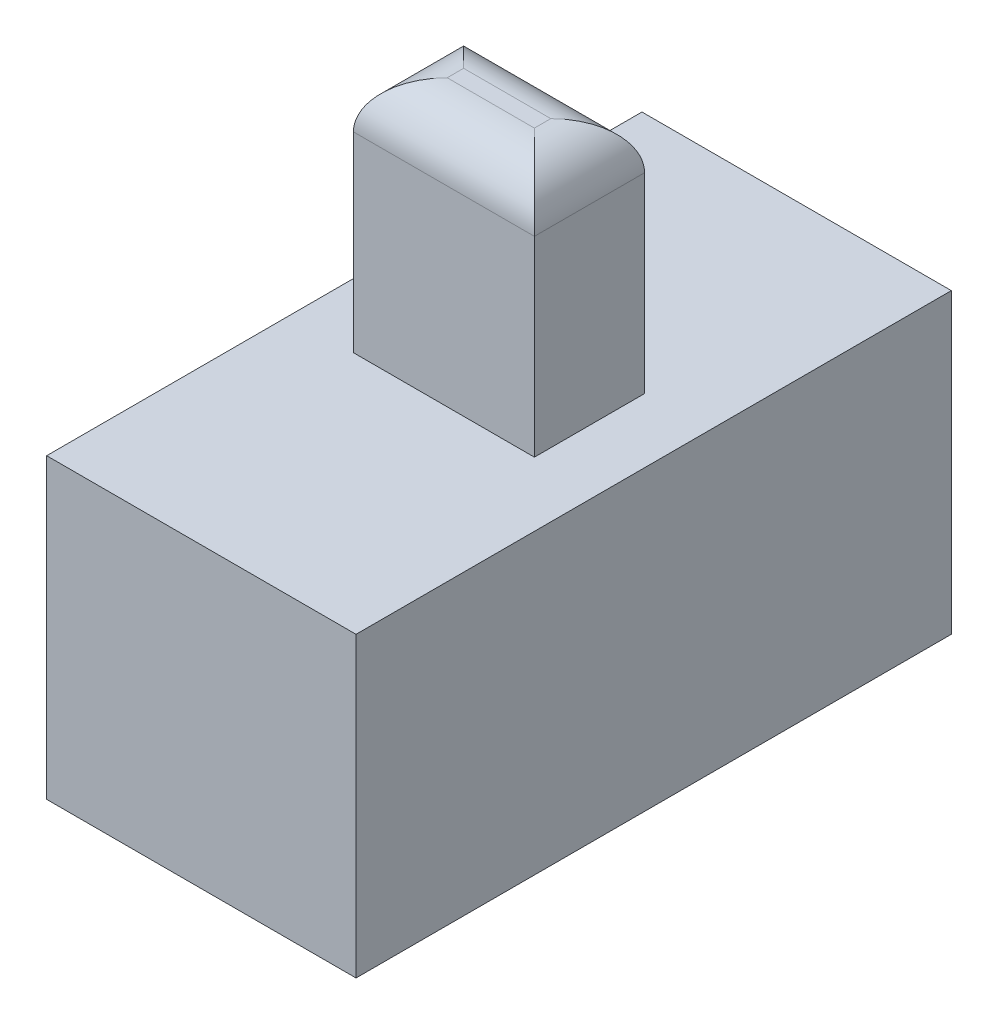
ISO-10303-21;
HEADER;
FILE_DESCRIPTION(('STEP AP214'),'2;1');
FILE_NAME('part.step','',(''),(''),'','','');
FILE_SCHEMA(('AUTOMOTIVE_DESIGN { 1 0 10303 214 1 1 1 1 }'));
ENDSEC;
DATA;
#1=APPLICATION_CONTEXT('core data for automotive mechanical design processes');
#2=APPLICATION_PROTOCOL_DEFINITION('international standard','automotive_design',2000,#1);
#3=PRODUCT_CONTEXT('',#1,'mechanical');
#4=PRODUCT('Part','Part','',(#3));
#5=PRODUCT_RELATED_PRODUCT_CATEGORY('part','',(#4));
#6=PRODUCT_DEFINITION_FORMATION('','',#4);
#7=PRODUCT_DEFINITION_CONTEXT('part definition',#1,'design');
#8=PRODUCT_DEFINITION('design','',#6,#7);
#9=PRODUCT_DEFINITION_SHAPE('','',#8);
#10=(LENGTH_UNIT() NAMED_UNIT(*) SI_UNIT(.MILLI.,.METRE.));
#11=(NAMED_UNIT(*) PLANE_ANGLE_UNIT() SI_UNIT($,.RADIAN.));
#12=(NAMED_UNIT(*) SI_UNIT($,.STERADIAN.) SOLID_ANGLE_UNIT());
#13=UNCERTAINTY_MEASURE_WITH_UNIT(LENGTH_MEASURE(1.E-05),#10,'distance_accuracy_value','');
#14=(GEOMETRIC_REPRESENTATION_CONTEXT(3) GLOBAL_UNCERTAINTY_ASSIGNED_CONTEXT((#13)) GLOBAL_UNIT_ASSIGNED_CONTEXT((#10,
#11,#12)) REPRESENTATION_CONTEXT('',''));
#15=CARTESIAN_POINT('',(0.,0.,0.));
#16=DIRECTION('',(0.,0.,1.));
#17=DIRECTION('',(1.,0.,0.));
#18=AXIS2_PLACEMENT_3D('',#15,#16,#17);
#19=CARTESIAN_POINT('',(0.,6.35,0.));
#20=DIRECTION('',(0.,-1.,0.));
#21=DIRECTION('',(0.,0.,-1.));
#22=AXIS2_PLACEMENT_3D('',#19,#20,#21);
#23=PLANE('',#22);
#24=DIRECTION('',(0.,0.,-1.));
#25=VECTOR('',#24,1.);
#26=CARTESIAN_POINT('',(3.3,6.35,6.35));
#27=LINE('',#26,#25);
#28=CARTESIAN_POINT('',(3.3,6.35,6.35));
#29=VERTEX_POINT('',#28);
#30=CARTESIAN_POINT('',(3.3,6.35,-6.35));
#31=VERTEX_POINT('',#30);
#32=EDGE_CURVE('E145',#29,#31,#27,.T.);
#33=ORIENTED_EDGE('',*,*,#32,.T.);
#34=DIRECTION('',(-1.,0.,0.));
#35=VECTOR('',#34,1.);
#36=CARTESIAN_POINT('',(-3.3,6.35,-6.35));
#37=LINE('',#36,#35);
#38=CARTESIAN_POINT('',(-3.3,6.35,-6.35));
#39=VERTEX_POINT('',#38);
#40=EDGE_CURVE('E148',#31,#39,#37,.T.);
#41=ORIENTED_EDGE('',*,*,#40,.T.);
#42=DIRECTION('',(0.,0.,1.));
#43=VECTOR('',#42,1.);
#44=CARTESIAN_POINT('',(-3.3,6.35,6.35));
#45=LINE('',#44,#43);
#46=CARTESIAN_POINT('',(-3.3,6.35,6.35));
#47=VERTEX_POINT('',#46);
#48=EDGE_CURVE('E151',#39,#47,#45,.T.);
#49=ORIENTED_EDGE('',*,*,#48,.T.);
#50=DIRECTION('',(1.,0.,0.));
#51=VECTOR('',#50,1.);
#52=CARTESIAN_POINT('',(-3.3,6.35,6.35));
#53=LINE('',#52,#51);
#54=EDGE_CURVE('E153',#47,#29,#53,.T.);
#55=ORIENTED_EDGE('',*,*,#54,.T.);
#56=EDGE_LOOP('',(#33,#41,#49,#55));
#57=FACE_BOUND('',#56,.T.);
#58=DIRECTION('',(0.,0.,-1.));
#59=VECTOR('',#58,1.);
#60=CARTESIAN_POINT('',(1.93,6.35,1.175));
#61=LINE('',#60,#59);
#62=CARTESIAN_POINT('',(1.93,6.35,1.175));
#63=VERTEX_POINT('',#62);
#64=CARTESIAN_POINT('',(1.93,6.35,-1.175));
#65=VERTEX_POINT('',#64);
#66=EDGE_CURVE('E135',#63,#65,#61,.T.);
#67=ORIENTED_EDGE('',*,*,#66,.F.);
#68=DIRECTION('',(1.,0.,0.));
#69=VECTOR('',#68,1.);
#70=CARTESIAN_POINT('',(-1.93,6.35,1.175));
#71=LINE('',#70,#69);
#72=CARTESIAN_POINT('',(-1.93,6.35,1.175));
#73=VERTEX_POINT('',#72);
#74=EDGE_CURVE('E132',#73,#63,#71,.T.);
#75=ORIENTED_EDGE('',*,*,#74,.F.);
#76=DIRECTION('',(0.,0.,1.));
#77=VECTOR('',#76,1.);
#78=CARTESIAN_POINT('',(-1.93,6.35,1.175));
#79=LINE('',#78,#77);
#80=CARTESIAN_POINT('',(-1.93,6.35,-1.175));
#81=VERTEX_POINT('',#80);
#82=EDGE_CURVE('E118',#81,#73,#79,.T.);
#83=ORIENTED_EDGE('',*,*,#82,.F.);
#84=DIRECTION('',(-1.,0.,0.));
#85=VECTOR('',#84,1.);
#86=CARTESIAN_POINT('',(-1.93,6.35,-1.175));
#87=LINE('',#86,#85);
#88=EDGE_CURVE('E129',#65,#81,#87,.T.);
#89=ORIENTED_EDGE('',*,*,#88,.F.);
#90=EDGE_LOOP('',(#67,#75,#83,#89));
#91=FACE_BOUND('',#90,.T.);
#92=ADVANCED_FACE('F36',(#57,#91),#23,.F.);
#93=CARTESIAN_POINT('',(3.3,6.35,6.35));
#94=DIRECTION('',(-1.,0.,0.));
#95=DIRECTION('',(0.,0.,1.));
#96=AXIS2_PLACEMENT_3D('',#93,#94,#95);
#97=PLANE('',#96);
#98=DIRECTION('',(0.,0.,-1.));
#99=VECTOR('',#98,1.);
#100=CARTESIAN_POINT('',(3.3,0.,6.35));
#101=LINE('',#100,#99);
#102=CARTESIAN_POINT('',(3.3,0.,6.35));
#103=VERTEX_POINT('',#102);
#104=CARTESIAN_POINT('',(3.3,0.,-6.35));
#105=VERTEX_POINT('',#104);
#106=EDGE_CURVE('E144',#103,#105,#101,.T.);
#107=ORIENTED_EDGE('',*,*,#106,.T.);
#108=DIRECTION('',(0.,-1.,0.));
#109=VECTOR('',#108,1.);
#110=CARTESIAN_POINT('',(3.3,6.35,-6.35));
#111=LINE('',#110,#109);
#112=EDGE_CURVE('E171',#31,#105,#111,.T.);
#113=ORIENTED_EDGE('',*,*,#112,.F.);
#114=ORIENTED_EDGE('',*,*,#32,.F.);
#115=DIRECTION('',(0.,-1.,0.));
#116=VECTOR('',#115,1.);
#117=CARTESIAN_POINT('',(3.3,6.35,6.35));
#118=LINE('',#117,#116);
#119=EDGE_CURVE('E155',#29,#103,#118,.T.);
#120=ORIENTED_EDGE('',*,*,#119,.T.);
#121=EDGE_LOOP('',(#107,#113,#114,#120));
#122=FACE_BOUND('',#121,.T.);
#123=ADVANCED_FACE('F220',(#122),#97,.F.);
#124=CARTESIAN_POINT('',(-3.3,6.35,-6.35));
#125=DIRECTION('',(0.,0.,1.));
#126=DIRECTION('',(1.,0.,0.));
#127=AXIS2_PLACEMENT_3D('',#124,#125,#126);
#128=PLANE('',#127);
#129=DIRECTION('',(-1.,0.,0.));
#130=VECTOR('',#129,1.);
#131=CARTESIAN_POINT('',(-3.3,0.,-6.35));
#132=LINE('',#131,#130);
#133=CARTESIAN_POINT('',(-3.3,0.,-6.35));
#134=VERTEX_POINT('',#133);
#135=EDGE_CURVE('E158',#105,#134,#132,.T.);
#136=ORIENTED_EDGE('',*,*,#135,.T.);
#137=DIRECTION('',(0.,-1.,0.));
#138=VECTOR('',#137,1.);
#139=CARTESIAN_POINT('',(-3.3,6.35,-6.35));
#140=LINE('',#139,#138);
#141=EDGE_CURVE('E168',#39,#134,#140,.T.);
#142=ORIENTED_EDGE('',*,*,#141,.F.);
#143=ORIENTED_EDGE('',*,*,#40,.F.);
#144=ORIENTED_EDGE('',*,*,#112,.T.);
#145=EDGE_LOOP('',(#136,#142,#143,#144));
#146=FACE_BOUND('',#145,.T.);
#147=ADVANCED_FACE('F226',(#146),#128,.F.);
#148=CARTESIAN_POINT('',(-3.3,6.35,6.35));
#149=DIRECTION('',(1.,0.,0.));
#150=DIRECTION('',(0.,0.,-1.));
#151=AXIS2_PLACEMENT_3D('',#148,#149,#150);
#152=PLANE('',#151);
#153=DIRECTION('',(0.,0.,1.));
#154=VECTOR('',#153,1.);
#155=CARTESIAN_POINT('',(-3.3,0.,6.35));
#156=LINE('',#155,#154);
#157=CARTESIAN_POINT('',(-3.3,0.,6.35));
#158=VERTEX_POINT('',#157);
#159=EDGE_CURVE('E160',#134,#158,#156,.T.);
#160=ORIENTED_EDGE('',*,*,#159,.T.);
#161=DIRECTION('',(0.,-1.,0.));
#162=VECTOR('',#161,1.);
#163=CARTESIAN_POINT('',(-3.3,6.35,6.35));
#164=LINE('',#163,#162);
#165=EDGE_CURVE('E165',#47,#158,#164,.T.);
#166=ORIENTED_EDGE('',*,*,#165,.F.);
#167=ORIENTED_EDGE('',*,*,#48,.F.);
#168=ORIENTED_EDGE('',*,*,#141,.T.);
#169=EDGE_LOOP('',(#160,#166,#167,#168));
#170=FACE_BOUND('',#169,.T.);
#171=ADVANCED_FACE('F240',(#170),#152,.F.);
#172=CARTESIAN_POINT('',(-3.3,6.35,6.35));
#173=DIRECTION('',(0.,0.,-1.));
#174=DIRECTION('',(-1.,0.,0.));
#175=AXIS2_PLACEMENT_3D('',#172,#173,#174);
#176=PLANE('',#175);
#177=DIRECTION('',(1.,0.,0.));
#178=VECTOR('',#177,1.);
#179=CARTESIAN_POINT('',(-3.3,0.,6.35));
#180=LINE('',#179,#178);
#181=EDGE_CURVE('E149',#158,#103,#180,.T.);
#182=ORIENTED_EDGE('',*,*,#181,.T.);
#183=ORIENTED_EDGE('',*,*,#119,.F.);
#184=ORIENTED_EDGE('',*,*,#54,.F.);
#185=ORIENTED_EDGE('',*,*,#165,.T.);
#186=EDGE_LOOP('',(#182,#183,#184,#185));
#187=FACE_BOUND('',#186,.T.);
#188=ADVANCED_FACE('F236',(#187),#176,.F.);
#189=CARTESIAN_POINT('',(0.,0.,0.));
#190=DIRECTION('',(0.,-1.,0.));
#191=DIRECTION('',(0.,0.,-1.));
#192=AXIS2_PLACEMENT_3D('',#189,#190,#191);
#193=PLANE('',#192);
#194=ORIENTED_EDGE('',*,*,#106,.F.);
#195=ORIENTED_EDGE('',*,*,#181,.F.);
#196=ORIENTED_EDGE('',*,*,#159,.F.);
#197=ORIENTED_EDGE('',*,*,#135,.F.);
#198=EDGE_LOOP('',(#194,#195,#196,#197));
#199=FACE_BOUND('',#198,.T.);
#200=ADVANCED_FACE('F233',(#199),#193,.T.);
#201=CARTESIAN_POINT('',(1.93,11.43,1.175));
#202=DIRECTION('',(-1.,0.,0.));
#203=DIRECTION('',(0.,0.,1.));
#204=AXIS2_PLACEMENT_3D('',#201,#202,#203);
#205=PLANE('',#204);
#206=DIRECTION('',(0.,-1.,0.));
#207=VECTOR('',#206,1.);
#208=CARTESIAN_POINT('',(1.93,11.43,-1.175));
#209=LINE('',#208,#207);
#210=CARTESIAN_POINT('',(1.93,10.43,-1.175));
#211=VERTEX_POINT('',#210);
#212=EDGE_CURVE('E122',#211,#65,#209,.T.);
#213=ORIENTED_EDGE('',*,*,#212,.F.);
#214=DIRECTION('',(0.,0.,-1.));
#215=VECTOR('',#214,1.);
#216=CARTESIAN_POINT('',(1.93,10.43,1.175));
#217=LINE('',#216,#215);
#218=CARTESIAN_POINT('',(1.93,10.43,1.175));
#219=VERTEX_POINT('',#218);
#220=EDGE_CURVE('E45',#211,#219,#217,.F.);
#221=ORIENTED_EDGE('',*,*,#220,.T.);
#222=DIRECTION('',(0.,-1.,0.));
#223=VECTOR('',#222,1.);
#224=CARTESIAN_POINT('',(1.93,11.43,1.175));
#225=LINE('',#224,#223);
#226=EDGE_CURVE('E140',#219,#63,#225,.T.);
#227=ORIENTED_EDGE('',*,*,#226,.T.);
#228=ORIENTED_EDGE('',*,*,#66,.T.);
#229=EDGE_LOOP('',(#213,#221,#227,#228));
#230=FACE_BOUND('',#229,.T.);
#231=ADVANCED_FACE('F231',(#230),#205,.F.);
#232=CARTESIAN_POINT('',(-1.93,11.43,-1.175));
#233=DIRECTION('',(0.,0.,1.));
#234=DIRECTION('',(1.,0.,0.));
#235=AXIS2_PLACEMENT_3D('',#232,#233,#234);
#236=PLANE('',#235);
#237=DIRECTION('',(0.,-1.,0.));
#238=VECTOR('',#237,1.);
#239=CARTESIAN_POINT('',(-1.93,11.43,-1.175));
#240=LINE('',#239,#238);
#241=CARTESIAN_POINT('',(-1.93,10.43,-1.175));
#242=VERTEX_POINT('',#241);
#243=EDGE_CURVE('E114',#242,#81,#240,.T.);
#244=ORIENTED_EDGE('',*,*,#243,.F.);
#245=DIRECTION('',(-1.,0.,0.));
#246=VECTOR('',#245,1.);
#247=CARTESIAN_POINT('',(-1.93,10.43,-1.175));
#248=LINE('',#247,#246);
#249=EDGE_CURVE('E60',#242,#211,#248,.F.);
#250=ORIENTED_EDGE('',*,*,#249,.T.);
#251=ORIENTED_EDGE('',*,*,#212,.T.);
#252=ORIENTED_EDGE('',*,*,#88,.T.);
#253=EDGE_LOOP('',(#244,#250,#251,#252));
#254=FACE_BOUND('',#253,.T.);
#255=ADVANCED_FACE('F134',(#254),#236,.F.);
#256=CARTESIAN_POINT('',(-1.93,11.43,1.175));
#257=DIRECTION('',(1.,0.,0.));
#258=DIRECTION('',(0.,0.,-1.));
#259=AXIS2_PLACEMENT_3D('',#256,#257,#258);
#260=PLANE('',#259);
#261=DIRECTION('',(0.,-1.,0.));
#262=VECTOR('',#261,1.);
#263=CARTESIAN_POINT('',(-1.93,11.43,1.175));
#264=LINE('',#263,#262);
#265=CARTESIAN_POINT('',(-1.93,10.43,1.175));
#266=VERTEX_POINT('',#265);
#267=EDGE_CURVE('E123',#266,#73,#264,.T.);
#268=ORIENTED_EDGE('',*,*,#267,.F.);
#269=DIRECTION('',(0.,0.,1.));
#270=VECTOR('',#269,1.);
#271=CARTESIAN_POINT('',(-1.93,10.43,1.175));
#272=LINE('',#271,#270);
#273=EDGE_CURVE('E120',#266,#242,#272,.F.);
#274=ORIENTED_EDGE('',*,*,#273,.T.);
#275=ORIENTED_EDGE('',*,*,#243,.T.);
#276=ORIENTED_EDGE('',*,*,#82,.T.);
#277=EDGE_LOOP('',(#268,#274,#275,#276));
#278=FACE_BOUND('',#277,.T.);
#279=ADVANCED_FACE('F117',(#278),#260,.F.);
#280=CARTESIAN_POINT('',(-1.93,11.43,1.175));
#281=DIRECTION('',(0.,0.,-1.));
#282=DIRECTION('',(-1.,0.,0.));
#283=AXIS2_PLACEMENT_3D('',#280,#281,#282);
#284=PLANE('',#283);
#285=ORIENTED_EDGE('',*,*,#226,.F.);
#286=DIRECTION('',(1.,0.,0.));
#287=VECTOR('',#286,1.);
#288=CARTESIAN_POINT('',(-1.93,10.43,1.175));
#289=LINE('',#288,#287);
#290=EDGE_CURVE('E11',#219,#266,#289,.F.);
#291=ORIENTED_EDGE('',*,*,#290,.T.);
#292=ORIENTED_EDGE('',*,*,#267,.T.);
#293=ORIENTED_EDGE('',*,*,#74,.T.);
#294=EDGE_LOOP('',(#285,#291,#292,#293));
#295=FACE_BOUND('',#294,.T.);
#296=ADVANCED_FACE('F206',(#295),#284,.F.);
#297=CARTESIAN_POINT('',(0.,11.43,0.));
#298=DIRECTION('',(0.,-1.,0.));
#299=DIRECTION('',(0.,0.,-1.));
#300=AXIS2_PLACEMENT_3D('',#297,#298,#299);
#301=PLANE('',#300);
#302=DIRECTION('',(-1.,0.,0.));
#303=VECTOR('',#302,1.);
#304=CARTESIAN_POINT('',(0.,11.43,-0.175));
#305=LINE('',#304,#303);
#306=CARTESIAN_POINT('',(0.93,11.43,-0.175));
#307=VERTEX_POINT('',#306);
#308=CARTESIAN_POINT('',(-0.93,11.43,-0.175));
#309=VERTEX_POINT('',#308);
#310=EDGE_CURVE('E178',#307,#309,#305,.T.);
#311=ORIENTED_EDGE('',*,*,#310,.T.);
#312=DIRECTION('',(0.,0.,1.));
#313=VECTOR('',#312,1.);
#314=CARTESIAN_POINT('',(-0.93,11.43,0.));
#315=LINE('',#314,#313);
#316=CARTESIAN_POINT('',(-0.93,11.43,0.175));
#317=VERTEX_POINT('',#316);
#318=EDGE_CURVE('E180',#309,#317,#315,.T.);
#319=ORIENTED_EDGE('',*,*,#318,.T.);
#320=DIRECTION('',(1.,0.,0.));
#321=VECTOR('',#320,1.);
#322=CARTESIAN_POINT('',(0.,11.43,0.175));
#323=LINE('',#322,#321);
#324=CARTESIAN_POINT('',(0.93,11.43,0.175));
#325=VERTEX_POINT('',#324);
#326=EDGE_CURVE('E174',#317,#325,#323,.T.);
#327=ORIENTED_EDGE('',*,*,#326,.T.);
#328=DIRECTION('',(0.,0.,-1.));
#329=VECTOR('',#328,1.);
#330=CARTESIAN_POINT('',(0.93,11.43,0.));
#331=LINE('',#330,#329);
#332=EDGE_CURVE('E176',#325,#307,#331,.T.);
#333=ORIENTED_EDGE('',*,*,#332,.T.);
#334=EDGE_LOOP('',(#311,#319,#327,#333));
#335=FACE_BOUND('',#334,.T.);
#336=ADVANCED_FACE('F211',(#335),#301,.F.);
#337=CARTESIAN_POINT('',(0.93,10.43,0.));
#338=DIRECTION('',(0.,0.,-1.));
#339=DIRECTION('',(-1.,0.,0.));
#340=AXIS2_PLACEMENT_3D('',#337,#338,#339);
#341=CYLINDRICAL_SURFACE('',#340,1.);
#342=CARTESIAN_POINT('',(0.93,10.43,0.175));
#343=DIRECTION('',(0.707106781186547,0.,-0.707106781186547));
#344=DIRECTION('',(0.707106781186547,0.,0.707106781186547));
#345=AXIS2_PLACEMENT_3D('',#342,#343,#344);
#346=ELLIPSE('',#345,1.41421356237309,1.);
#347=EDGE_CURVE('E189',#219,#325,#346,.F.);
#348=ORIENTED_EDGE('',*,*,#347,.F.);
#349=ORIENTED_EDGE('',*,*,#220,.F.);
#350=CARTESIAN_POINT('',(0.93,10.43,-0.175));
#351=DIRECTION('',(-0.707106781186547,0.,-0.707106781186547));
#352=DIRECTION('',(0.707106781186547,0.,-0.707106781186547));
#353=AXIS2_PLACEMENT_3D('',#350,#351,#352);
#354=ELLIPSE('',#353,1.41421356237309,1.);
#355=EDGE_CURVE('E40',#307,#211,#354,.T.);
#356=ORIENTED_EDGE('',*,*,#355,.F.);
#357=ORIENTED_EDGE('',*,*,#332,.F.);
#358=EDGE_LOOP('',(#348,#349,#356,#357));
#359=FACE_BOUND('',#358,.T.);
#360=ADVANCED_FACE('F38',(#359),#341,.T.);
#361=CARTESIAN_POINT('',(0.,10.43,-0.175));
#362=DIRECTION('',(-1.,0.,0.));
#363=DIRECTION('',(0.,0.,1.));
#364=AXIS2_PLACEMENT_3D('',#361,#362,#363);
#365=CYLINDRICAL_SURFACE('',#364,1.);
#366=ORIENTED_EDGE('',*,*,#355,.T.);
#367=ORIENTED_EDGE('',*,*,#249,.F.);
#368=CARTESIAN_POINT('',(-0.93,10.43,-0.175));
#369=DIRECTION('',(-0.707106781186547,0.,0.707106781186547));
#370=DIRECTION('',(-0.707106781186547,0.,-0.707106781186547));
#371=AXIS2_PLACEMENT_3D('',#368,#369,#370);
#372=ELLIPSE('',#371,1.41421356237309,1.);
#373=EDGE_CURVE('E188',#309,#242,#372,.T.);
#374=ORIENTED_EDGE('',*,*,#373,.F.);
#375=ORIENTED_EDGE('',*,*,#310,.F.);
#376=EDGE_LOOP('',(#366,#367,#374,#375));
#377=FACE_BOUND('',#376,.T.);
#378=ADVANCED_FACE('F199',(#377),#365,.T.);
#379=CARTESIAN_POINT('',(0.,10.43,0.175));
#380=DIRECTION('',(1.,0.,0.));
#381=DIRECTION('',(0.,0.,-1.));
#382=AXIS2_PLACEMENT_3D('',#379,#380,#381);
#383=CYLINDRICAL_SURFACE('',#382,1.);
#384=ORIENTED_EDGE('',*,*,#347,.T.);
#385=ORIENTED_EDGE('',*,*,#326,.F.);
#386=CARTESIAN_POINT('',(-0.93,10.43,0.175));
#387=DIRECTION('',(0.707106781186547,0.,0.707106781186547));
#388=DIRECTION('',(0.707106781186547,0.,-0.707106781186547));
#389=AXIS2_PLACEMENT_3D('',#386,#387,#388);
#390=ELLIPSE('',#389,1.41421356237309,1.);
#391=EDGE_CURVE('E186',#266,#317,#390,.F.);
#392=ORIENTED_EDGE('',*,*,#391,.F.);
#393=ORIENTED_EDGE('',*,*,#290,.F.);
#394=EDGE_LOOP('',(#384,#385,#392,#393));
#395=FACE_BOUND('',#394,.T.);
#396=ADVANCED_FACE('F204',(#395),#383,.T.);
#397=CARTESIAN_POINT('',(-0.93,10.43,0.));
#398=DIRECTION('',(0.,0.,1.));
#399=DIRECTION('',(1.,0.,0.));
#400=AXIS2_PLACEMENT_3D('',#397,#398,#399);
#401=CYLINDRICAL_SURFACE('',#400,1.);
#402=ORIENTED_EDGE('',*,*,#373,.T.);
#403=ORIENTED_EDGE('',*,*,#273,.F.);
#404=ORIENTED_EDGE('',*,*,#391,.T.);
#405=ORIENTED_EDGE('',*,*,#318,.F.);
#406=EDGE_LOOP('',(#402,#403,#404,#405));
#407=FACE_BOUND('',#406,.T.);
#408=ADVANCED_FACE('F208',(#407),#401,.T.);
#409=CLOSED_SHELL('',(#92,#123,#147,#171,#188,#200,#231,#255,#279,#296,#336,#360,#378,#396,#408));
#410=MANIFOLD_SOLID_BREP('B2',#409);
#411=ADVANCED_BREP_SHAPE_REPRESENTATION('',(#18,#410),#14);
#412=SHAPE_DEFINITION_REPRESENTATION(#9,#411);
ENDSEC;
END-ISO-10303-21;
